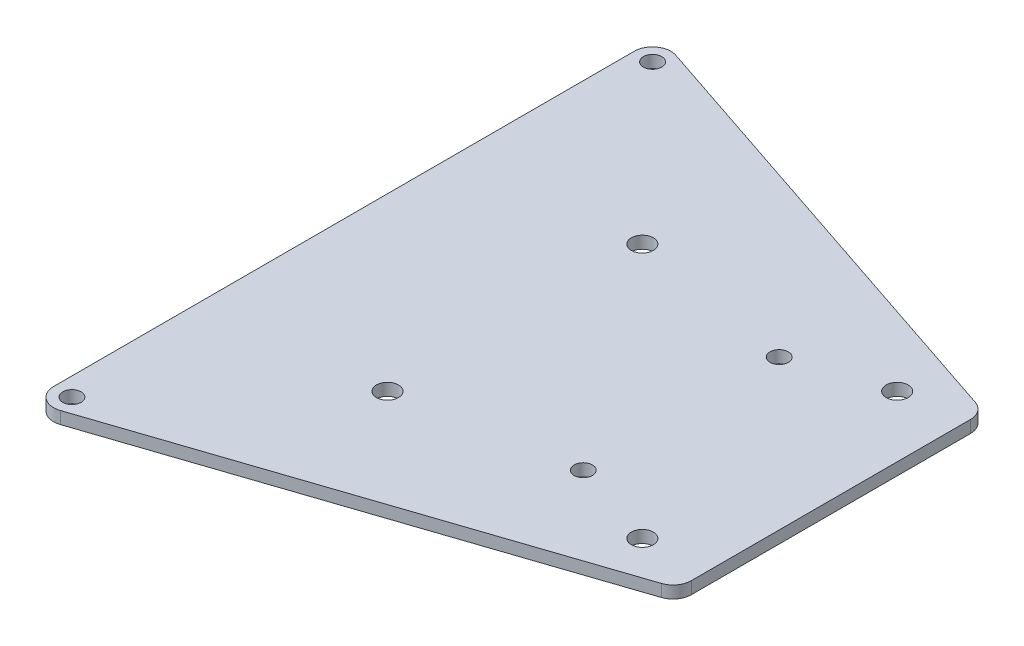
ISO-10303-21;
HEADER;
FILE_DESCRIPTION(('STEP AP214'),'2;1');
FILE_NAME('part.step','',(''),(''),'','','');
FILE_SCHEMA(('AUTOMOTIVE_DESIGN { 1 0 10303 214 1 1 1 1 }'));
ENDSEC;
DATA;
#1=APPLICATION_CONTEXT('core data for automotive mechanical design processes');
#2=APPLICATION_PROTOCOL_DEFINITION('international standard','automotive_design',2000,#1);
#3=PRODUCT_CONTEXT('',#1,'mechanical');
#4=PRODUCT('Part','Part','',(#3));
#5=PRODUCT_RELATED_PRODUCT_CATEGORY('part','',(#4));
#6=PRODUCT_DEFINITION_FORMATION('','',#4);
#7=PRODUCT_DEFINITION_CONTEXT('part definition',#1,'design');
#8=PRODUCT_DEFINITION('design','',#6,#7);
#9=PRODUCT_DEFINITION_SHAPE('','',#8);
#10=(LENGTH_UNIT() NAMED_UNIT(*) SI_UNIT(.MILLI.,.METRE.));
#11=(NAMED_UNIT(*) PLANE_ANGLE_UNIT() SI_UNIT($,.RADIAN.));
#12=(NAMED_UNIT(*) SI_UNIT($,.STERADIAN.) SOLID_ANGLE_UNIT());
#13=UNCERTAINTY_MEASURE_WITH_UNIT(LENGTH_MEASURE(1.E-05),#10,'distance_accuracy_value','');
#14=(GEOMETRIC_REPRESENTATION_CONTEXT(3) GLOBAL_UNCERTAINTY_ASSIGNED_CONTEXT((#13)) GLOBAL_UNIT_ASSIGNED_CONTEXT((#10,
#11,#12)) REPRESENTATION_CONTEXT('',''));
#15=CARTESIAN_POINT('',(0.,0.,0.));
#16=DIRECTION('',(0.,0.,1.));
#17=DIRECTION('',(1.,0.,0.));
#18=AXIS2_PLACEMENT_3D('',#15,#16,#17);
#19=CARTESIAN_POINT('',(73.72,2.,24.6841957224712));
#20=DIRECTION('',(0.,-1.,0.));
#21=DIRECTION('',(0.,0.,-1.));
#22=AXIS2_PLACEMENT_3D('',#19,#20,#21);
#23=CYLINDRICAL_SURFACE('',#22,3.00000000000001);
#24=CARTESIAN_POINT('',(73.72,0.,24.6841957224712));
#25=DIRECTION('',(0.,1.,0.));
#26=DIRECTION('',(0.,0.,1.));
#27=AXIS2_PLACEMENT_3D('',#24,#25,#26);
#28=CIRCLE('',#27,3.00000000000001);
#29=CARTESIAN_POINT('',(74.6725326685041,0.,21.8394318455506));
#30=VERTEX_POINT('',#29);
#31=CARTESIAN_POINT('',(76.72,0.,24.6841957224712));
#32=VERTEX_POINT('',#31);
#33=EDGE_CURVE('E159',#30,#32,#28,.F.);
#34=ORIENTED_EDGE('',*,*,#33,.F.);
#35=DIRECTION('',(0.,-1.,0.));
#36=VECTOR('',#35,1.);
#37=CARTESIAN_POINT('',(74.6725326685041,2.,21.8394318455506));
#38=LINE('',#37,#36);
#39=CARTESIAN_POINT('',(74.6725326685041,2.,21.8394318455506));
#40=VERTEX_POINT('',#39);
#41=EDGE_CURVE('E11',#40,#30,#38,.T.);
#42=ORIENTED_EDGE('',*,*,#41,.F.);
#43=CARTESIAN_POINT('',(73.72,2.,24.6841957224712));
#44=DIRECTION('',(0.,1.,0.));
#45=DIRECTION('',(0.,0.,1.));
#46=AXIS2_PLACEMENT_3D('',#43,#44,#45);
#47=CIRCLE('',#46,3.00000000000001);
#48=CARTESIAN_POINT('',(76.72,2.,24.6841957224712));
#49=VERTEX_POINT('',#48);
#50=EDGE_CURVE('E231',#40,#49,#47,.F.);
#51=ORIENTED_EDGE('',*,*,#50,.T.);
#52=DIRECTION('',(0.,-1.,0.));
#53=VECTOR('',#52,1.);
#54=CARTESIAN_POINT('',(76.72,2.,24.6841957224712));
#55=LINE('',#54,#53);
#56=EDGE_CURVE('E59',#49,#32,#55,.T.);
#57=ORIENTED_EDGE('',*,*,#56,.T.);
#58=EDGE_LOOP('',(#34,#42,#51,#57));
#59=FACE_BOUND('',#58,.T.);
#60=ADVANCED_FACE('F41',(#59),#23,.T.);
#61=CARTESIAN_POINT('',(0.952532668504129,2.,-2.84476387692061));
#62=DIRECTION('',(0.317510889501376,0.,-0.948254625640205));
#63=DIRECTION('',(-0.948254625640205,0.,-0.317510889501377));
#64=AXIS2_PLACEMENT_3D('',#61,#62,#63);
#65=PLANE('',#64);
#66=DIRECTION('',(0.948254625640205,0.,0.317510889501377));
#67=VECTOR('',#66,1.);
#68=CARTESIAN_POINT('',(0.952532668504129,0.,-2.84476387692061));
#69=LINE('',#68,#67);
#70=CARTESIAN_POINT('',(0.952532668504129,0.,-2.84476387692061));
#71=VERTEX_POINT('',#70);
#72=EDGE_CURVE('E165',#71,#30,#69,.T.);
#73=ORIENTED_EDGE('',*,*,#72,.F.);
#74=DIRECTION('',(0.,-1.,0.));
#75=VECTOR('',#74,1.);
#76=CARTESIAN_POINT('',(0.952532668504129,2.,-2.84476387692061));
#77=LINE('',#76,#75);
#78=CARTESIAN_POINT('',(0.952532668504129,2.,-2.84476387692061));
#79=VERTEX_POINT('',#78);
#80=EDGE_CURVE('E49',#79,#71,#77,.T.);
#81=ORIENTED_EDGE('',*,*,#80,.F.);
#82=DIRECTION('',(0.948254625640205,0.,0.317510889501377));
#83=VECTOR('',#82,1.);
#84=CARTESIAN_POINT('',(0.952532668504129,2.,-2.84476387692061));
#85=LINE('',#84,#83);
#86=EDGE_CURVE('E227',#79,#40,#85,.T.);
#87=ORIENTED_EDGE('',*,*,#86,.T.);
#88=ORIENTED_EDGE('',*,*,#41,.T.);
#89=EDGE_LOOP('',(#73,#81,#87,#88));
#90=FACE_BOUND('',#89,.T.);
#91=ADVANCED_FACE('F217',(#90),#65,.T.);
#92=CARTESIAN_POINT('',(0.,2.,0.));
#93=DIRECTION('',(0.,-1.,0.));
#94=DIRECTION('',(0.,0.,-1.));
#95=AXIS2_PLACEMENT_3D('',#92,#93,#94);
#96=CYLINDRICAL_SURFACE('',#95,3.);
#97=CARTESIAN_POINT('',(0.,0.,0.));
#98=DIRECTION('',(0.,1.,0.));
#99=DIRECTION('',(0.,0.,1.));
#100=AXIS2_PLACEMENT_3D('',#97,#98,#99);
#101=CIRCLE('',#100,3.);
#102=CARTESIAN_POINT('',(-3.,0.,0.));
#103=VERTEX_POINT('',#102);
#104=EDGE_CURVE('E164',#103,#71,#101,.F.);
#105=ORIENTED_EDGE('',*,*,#104,.F.);
#106=DIRECTION('',(0.,-1.,0.));
#107=VECTOR('',#106,1.);
#108=CARTESIAN_POINT('',(-3.,2.,0.));
#109=LINE('',#108,#107);
#110=CARTESIAN_POINT('',(-3.,2.,0.));
#111=VERTEX_POINT('',#110);
#112=EDGE_CURVE('E210',#111,#103,#109,.T.);
#113=ORIENTED_EDGE('',*,*,#112,.F.);
#114=CARTESIAN_POINT('',(0.,2.,0.));
#115=DIRECTION('',(0.,1.,0.));
#116=DIRECTION('',(0.,0.,1.));
#117=AXIS2_PLACEMENT_3D('',#114,#115,#116);
#118=CIRCLE('',#117,3.);
#119=EDGE_CURVE('E212',#111,#79,#118,.F.);
#120=ORIENTED_EDGE('',*,*,#119,.T.);
#121=ORIENTED_EDGE('',*,*,#80,.T.);
#122=EDGE_LOOP('',(#105,#113,#120,#121));
#123=FACE_BOUND('',#122,.T.);
#124=ADVANCED_FACE('F215',(#123),#96,.T.);
#125=CARTESIAN_POINT('',(-3.,2.,0.));
#126=DIRECTION('',(-1.,0.,0.));
#127=DIRECTION('',(0.,0.,1.));
#128=AXIS2_PLACEMENT_3D('',#125,#126,#127);
#129=PLANE('',#128);
#130=DIRECTION('',(0.,0.,-1.));
#131=VECTOR('',#130,1.);
#132=CARTESIAN_POINT('',(-3.,0.,0.));
#133=LINE('',#132,#131);
#134=CARTESIAN_POINT('',(-3.,0.,95.05));
#135=VERTEX_POINT('',#134);
#136=EDGE_CURVE('E169',#135,#103,#133,.T.);
#137=ORIENTED_EDGE('',*,*,#136,.F.);
#138=DIRECTION('',(0.,-1.,0.));
#139=VECTOR('',#138,1.);
#140=CARTESIAN_POINT('',(-3.,2.,95.05));
#141=LINE('',#140,#139);
#142=CARTESIAN_POINT('',(-3.,2.,95.05));
#143=VERTEX_POINT('',#142);
#144=EDGE_CURVE('E202',#143,#135,#141,.T.);
#145=ORIENTED_EDGE('',*,*,#144,.F.);
#146=DIRECTION('',(0.,0.,-1.));
#147=VECTOR('',#146,1.);
#148=CARTESIAN_POINT('',(-3.,2.,0.));
#149=LINE('',#148,#147);
#150=EDGE_CURVE('E230',#143,#111,#149,.T.);
#151=ORIENTED_EDGE('',*,*,#150,.T.);
#152=ORIENTED_EDGE('',*,*,#112,.T.);
#153=EDGE_LOOP('',(#137,#145,#151,#152));
#154=FACE_BOUND('',#153,.T.);
#155=ADVANCED_FACE('F223',(#154),#129,.T.);
#156=CARTESIAN_POINT('',(0.,2.,95.05));
#157=DIRECTION('',(0.,-1.,0.));
#158=DIRECTION('',(0.,0.,-1.));
#159=AXIS2_PLACEMENT_3D('',#156,#157,#158);
#160=CYLINDRICAL_SURFACE('',#159,3.);
#161=CARTESIAN_POINT('',(0.,0.,95.05));
#162=DIRECTION('',(0.,1.,0.));
#163=DIRECTION('',(0.,0.,1.));
#164=AXIS2_PLACEMENT_3D('',#161,#162,#163);
#165=CIRCLE('',#164,3.);
#166=CARTESIAN_POINT('',(0.952532668504126,0.,97.8947638769206));
#167=VERTEX_POINT('',#166);
#168=EDGE_CURVE('E171',#167,#135,#165,.F.);
#169=ORIENTED_EDGE('',*,*,#168,.F.);
#170=DIRECTION('',(0.,-1.,0.));
#171=VECTOR('',#170,1.);
#172=CARTESIAN_POINT('',(0.952532668504126,2.,97.8947638769206));
#173=LINE('',#172,#171);
#174=CARTESIAN_POINT('',(0.952532668504126,2.,97.8947638769206));
#175=VERTEX_POINT('',#174);
#176=EDGE_CURVE('E120',#175,#167,#173,.T.);
#177=ORIENTED_EDGE('',*,*,#176,.F.);
#178=CARTESIAN_POINT('',(0.,2.,95.05));
#179=DIRECTION('',(0.,1.,0.));
#180=DIRECTION('',(0.,0.,1.));
#181=AXIS2_PLACEMENT_3D('',#178,#179,#180);
#182=CIRCLE('',#181,3.);
#183=EDGE_CURVE('E126',#175,#143,#182,.F.);
#184=ORIENTED_EDGE('',*,*,#183,.T.);
#185=ORIENTED_EDGE('',*,*,#144,.T.);
#186=EDGE_LOOP('',(#169,#177,#184,#185));
#187=FACE_BOUND('',#186,.T.);
#188=ADVANCED_FACE('F234',(#187),#160,.T.);
#189=CARTESIAN_POINT('',(29.5702978447647,2.,88.3124725482373));
#190=DIRECTION('',(0.317510889501376,0.,0.948254625640205));
#191=DIRECTION('',(0.948254625640205,0.,-0.317510889501377));
#192=AXIS2_PLACEMENT_3D('',#189,#190,#191);
#193=PLANE('',#192);
#194=DIRECTION('',(-0.948254625640205,0.,0.317510889501377));
#195=VECTOR('',#194,1.);
#196=CARTESIAN_POINT('',(29.5702978447647,0.,88.3124725482373));
#197=LINE('',#196,#195);
#198=CARTESIAN_POINT('',(74.6725326685041,0.,73.2105681544494));
#199=VERTEX_POINT('',#198);
#200=EDGE_CURVE('E114',#199,#167,#197,.T.);
#201=ORIENTED_EDGE('',*,*,#200,.F.);
#202=DIRECTION('',(0.,-1.,0.));
#203=VECTOR('',#202,1.);
#204=CARTESIAN_POINT('',(74.6725326685041,2.,73.2105681544494));
#205=LINE('',#204,#203);
#206=CARTESIAN_POINT('',(74.6725326685041,2.,73.2105681544494));
#207=VERTEX_POINT('',#206);
#208=EDGE_CURVE('E107',#207,#199,#205,.T.);
#209=ORIENTED_EDGE('',*,*,#208,.F.);
#210=DIRECTION('',(-0.948254625640205,0.,0.317510889501377));
#211=VECTOR('',#210,1.);
#212=CARTESIAN_POINT('',(29.5702978447647,2.,88.3124725482373));
#213=LINE('',#212,#211);
#214=EDGE_CURVE('E112',#207,#175,#213,.T.);
#215=ORIENTED_EDGE('',*,*,#214,.T.);
#216=ORIENTED_EDGE('',*,*,#176,.T.);
#217=EDGE_LOOP('',(#201,#209,#215,#216));
#218=FACE_BOUND('',#217,.T.);
#219=ADVANCED_FACE('F109',(#218),#193,.T.);
#220=CARTESIAN_POINT('',(73.72,2.,70.3658042775288));
#221=DIRECTION('',(0.,-1.,0.));
#222=DIRECTION('',(0.,0.,-1.));
#223=AXIS2_PLACEMENT_3D('',#220,#221,#222);
#224=CYLINDRICAL_SURFACE('',#223,3.);
#225=CARTESIAN_POINT('',(73.72,0.,70.3658042775288));
#226=DIRECTION('',(0.,1.,0.));
#227=DIRECTION('',(0.,0.,1.));
#228=AXIS2_PLACEMENT_3D('',#225,#226,#227);
#229=CIRCLE('',#228,3.);
#230=CARTESIAN_POINT('',(76.72,0.,70.3658042775288));
#231=VERTEX_POINT('',#230);
#232=EDGE_CURVE('E174',#231,#199,#229,.F.);
#233=ORIENTED_EDGE('',*,*,#232,.F.);
#234=DIRECTION('',(0.,-1.,0.));
#235=VECTOR('',#234,1.);
#236=CARTESIAN_POINT('',(76.72,2.,70.3658042775288));
#237=LINE('',#236,#235);
#238=CARTESIAN_POINT('',(76.72,2.,70.3658042775288));
#239=VERTEX_POINT('',#238);
#240=EDGE_CURVE('E83',#239,#231,#237,.T.);
#241=ORIENTED_EDGE('',*,*,#240,.F.);
#242=CARTESIAN_POINT('',(73.72,2.,70.3658042775288));
#243=DIRECTION('',(0.,1.,0.));
#244=DIRECTION('',(0.,0.,1.));
#245=AXIS2_PLACEMENT_3D('',#242,#243,#244);
#246=CIRCLE('',#245,3.);
#247=EDGE_CURVE('E124',#239,#207,#246,.F.);
#248=ORIENTED_EDGE('',*,*,#247,.T.);
#249=ORIENTED_EDGE('',*,*,#208,.T.);
#250=EDGE_LOOP('',(#233,#241,#248,#249));
#251=FACE_BOUND('',#250,.T.);
#252=ADVANCED_FACE('F128',(#251),#224,.T.);
#253=CARTESIAN_POINT('',(25.,2.,68.395));
#254=DIRECTION('',(0.,-1.,0.));
#255=DIRECTION('',(0.,0.,-1.));
#256=AXIS2_PLACEMENT_3D('',#253,#254,#255);
#257=CYLINDRICAL_SURFACE('',#256,1.8);
#258=CARTESIAN_POINT('',(25.,2.,68.395));
#259=DIRECTION('',(0.,1.,0.));
#260=DIRECTION('',(0.,0.,1.));
#261=AXIS2_PLACEMENT_3D('',#258,#259,#260);
#262=CIRCLE('',#261,1.8);
#263=CARTESIAN_POINT('',(25.,2.,70.195));
#264=VERTEX_POINT('',#263);
#265=EDGE_CURVE('E151',#264,#264,#262,.T.);
#266=ORIENTED_EDGE('',*,*,#265,.T.);
#267=EDGE_LOOP('',(#266));
#268=FACE_BOUND('',#267,.T.);
#269=CARTESIAN_POINT('',(25.,0.,68.395));
#270=DIRECTION('',(0.,1.,0.));
#271=DIRECTION('',(0.,0.,1.));
#272=AXIS2_PLACEMENT_3D('',#269,#270,#271);
#273=CIRCLE('',#272,1.8);
#274=CARTESIAN_POINT('',(25.,0.,70.195));
#275=VERTEX_POINT('',#274);
#276=EDGE_CURVE('E194',#275,#275,#273,.T.);
#277=ORIENTED_EDGE('',*,*,#276,.F.);
#278=EDGE_LOOP('',(#277));
#279=FACE_BOUND('',#278,.T.);
#280=ADVANCED_FACE('F262',(#268,#279),#257,.F.);
#281=CARTESIAN_POINT('',(66.72,2.,26.675));
#282=DIRECTION('',(0.,-1.,0.));
#283=DIRECTION('',(0.,0.,-1.));
#284=AXIS2_PLACEMENT_3D('',#281,#282,#283);
#285=CYLINDRICAL_SURFACE('',#284,1.79999999999999);
#286=CARTESIAN_POINT('',(66.72,2.,26.675));
#287=DIRECTION('',(0.,1.,0.));
#288=DIRECTION('',(0.,0.,1.));
#289=AXIS2_PLACEMENT_3D('',#286,#287,#288);
#290=CIRCLE('',#289,1.79999999999999);
#291=CARTESIAN_POINT('',(66.72,2.,28.475));
#292=VERTEX_POINT('',#291);
#293=EDGE_CURVE('E146',#292,#292,#290,.T.);
#294=ORIENTED_EDGE('',*,*,#293,.T.);
#295=EDGE_LOOP('',(#294));
#296=FACE_BOUND('',#295,.T.);
#297=CARTESIAN_POINT('',(66.72,0.,26.675));
#298=DIRECTION('',(0.,1.,0.));
#299=DIRECTION('',(0.,0.,1.));
#300=AXIS2_PLACEMENT_3D('',#297,#298,#299);
#301=CIRCLE('',#300,1.79999999999999);
#302=CARTESIAN_POINT('',(66.72,0.,28.475));
#303=VERTEX_POINT('',#302);
#304=EDGE_CURVE('E195',#303,#303,#301,.T.);
#305=ORIENTED_EDGE('',*,*,#304,.F.);
#306=EDGE_LOOP('',(#305));
#307=FACE_BOUND('',#306,.T.);
#308=ADVANCED_FACE('F268',(#296,#307),#285,.F.);
#309=CARTESIAN_POINT('',(66.72,2.,68.395));
#310=DIRECTION('',(0.,-1.,0.));
#311=DIRECTION('',(0.,0.,-1.));
#312=AXIS2_PLACEMENT_3D('',#309,#310,#311);
#313=CYLINDRICAL_SURFACE('',#312,1.79999999999998);
#314=CARTESIAN_POINT('',(66.72,2.,68.395));
#315=DIRECTION('',(0.,1.,0.));
#316=DIRECTION('',(0.,0.,1.));
#317=AXIS2_PLACEMENT_3D('',#314,#315,#316);
#318=CIRCLE('',#317,1.79999999999998);
#319=CARTESIAN_POINT('',(66.72,2.,70.195));
#320=VERTEX_POINT('',#319);
#321=EDGE_CURVE('E144',#320,#320,#318,.T.);
#322=ORIENTED_EDGE('',*,*,#321,.T.);
#323=EDGE_LOOP('',(#322));
#324=FACE_BOUND('',#323,.T.);
#325=CARTESIAN_POINT('',(66.72,0.,68.395));
#326=DIRECTION('',(0.,1.,0.));
#327=DIRECTION('',(0.,0.,1.));
#328=AXIS2_PLACEMENT_3D('',#325,#326,#327);
#329=CIRCLE('',#328,1.79999999999998);
#330=CARTESIAN_POINT('',(66.72,0.,70.195));
#331=VERTEX_POINT('',#330);
#332=EDGE_CURVE('E188',#331,#331,#329,.T.);
#333=ORIENTED_EDGE('',*,*,#332,.F.);
#334=EDGE_LOOP('',(#333));
#335=FACE_BOUND('',#334,.T.);
#336=ADVANCED_FACE('F273',(#324,#335),#313,.F.);
#337=CARTESIAN_POINT('',(0.,2.,0.));
#338=DIRECTION('',(0.,-1.,0.));
#339=DIRECTION('',(0.,0.,-1.));
#340=AXIS2_PLACEMENT_3D('',#337,#338,#339);
#341=CYLINDRICAL_SURFACE('',#340,1.5);
#342=CARTESIAN_POINT('',(0.,2.,0.));
#343=DIRECTION('',(0.,1.,0.));
#344=DIRECTION('',(0.,0.,1.));
#345=AXIS2_PLACEMENT_3D('',#342,#343,#344);
#346=CIRCLE('',#345,1.5);
#347=CARTESIAN_POINT('',(0.,2.,1.5));
#348=VERTEX_POINT('',#347);
#349=EDGE_CURVE('E142',#348,#348,#346,.T.);
#350=ORIENTED_EDGE('',*,*,#349,.T.);
#351=EDGE_LOOP('',(#350));
#352=FACE_BOUND('',#351,.T.);
#353=CARTESIAN_POINT('',(0.,0.,0.));
#354=DIRECTION('',(0.,1.,0.));
#355=DIRECTION('',(0.,0.,1.));
#356=AXIS2_PLACEMENT_3D('',#353,#354,#355);
#357=CIRCLE('',#356,1.5);
#358=CARTESIAN_POINT('',(0.,0.,1.5));
#359=VERTEX_POINT('',#358);
#360=EDGE_CURVE('E186',#359,#359,#357,.T.);
#361=ORIENTED_EDGE('',*,*,#360,.F.);
#362=EDGE_LOOP('',(#361));
#363=FACE_BOUND('',#362,.T.);
#364=ADVANCED_FACE('F282',(#352,#363),#341,.F.);
#365=CARTESIAN_POINT('',(52.22,2.,31.49));
#366=DIRECTION('',(0.,-1.,0.));
#367=DIRECTION('',(0.,0.,-1.));
#368=AXIS2_PLACEMENT_3D('',#365,#366,#367);
#369=CYLINDRICAL_SURFACE('',#368,1.5);
#370=CARTESIAN_POINT('',(52.22,2.,31.49));
#371=DIRECTION('',(0.,1.,0.));
#372=DIRECTION('',(0.,0.,1.));
#373=AXIS2_PLACEMENT_3D('',#370,#371,#372);
#374=CIRCLE('',#373,1.5);
#375=CARTESIAN_POINT('',(52.22,2.,32.99));
#376=VERTEX_POINT('',#375);
#377=EDGE_CURVE('E137',#376,#376,#374,.T.);
#378=ORIENTED_EDGE('',*,*,#377,.T.);
#379=EDGE_LOOP('',(#378));
#380=FACE_BOUND('',#379,.T.);
#381=CARTESIAN_POINT('',(52.22,0.,31.49));
#382=DIRECTION('',(0.,1.,0.));
#383=DIRECTION('',(0.,0.,1.));
#384=AXIS2_PLACEMENT_3D('',#381,#382,#383);
#385=CIRCLE('',#384,1.5);
#386=CARTESIAN_POINT('',(52.22,0.,32.99));
#387=VERTEX_POINT('',#386);
#388=EDGE_CURVE('E181',#387,#387,#385,.T.);
#389=ORIENTED_EDGE('',*,*,#388,.F.);
#390=EDGE_LOOP('',(#389));
#391=FACE_BOUND('',#390,.T.);
#392=ADVANCED_FACE('F246',(#380,#391),#369,.F.);
#393=CARTESIAN_POINT('',(52.22,2.,63.56));
#394=DIRECTION('',(0.,-1.,0.));
#395=DIRECTION('',(0.,0.,-1.));
#396=AXIS2_PLACEMENT_3D('',#393,#394,#395);
#397=CYLINDRICAL_SURFACE('',#396,1.5);
#398=CARTESIAN_POINT('',(52.22,2.,63.56));
#399=DIRECTION('',(0.,1.,0.));
#400=DIRECTION('',(0.,0.,1.));
#401=AXIS2_PLACEMENT_3D('',#398,#399,#400);
#402=CIRCLE('',#401,1.5);
#403=CARTESIAN_POINT('',(52.22,2.,65.06));
#404=VERTEX_POINT('',#403);
#405=EDGE_CURVE('E132',#404,#404,#402,.T.);
#406=ORIENTED_EDGE('',*,*,#405,.T.);
#407=EDGE_LOOP('',(#406));
#408=FACE_BOUND('',#407,.T.);
#409=CARTESIAN_POINT('',(52.22,0.,63.56));
#410=DIRECTION('',(0.,1.,0.));
#411=DIRECTION('',(0.,0.,1.));
#412=AXIS2_PLACEMENT_3D('',#409,#410,#411);
#413=CIRCLE('',#412,1.5);
#414=CARTESIAN_POINT('',(52.22,0.,65.06));
#415=VERTEX_POINT('',#414);
#416=EDGE_CURVE('E179',#415,#415,#413,.T.);
#417=ORIENTED_EDGE('',*,*,#416,.F.);
#418=EDGE_LOOP('',(#417));
#419=FACE_BOUND('',#418,.T.);
#420=ADVANCED_FACE('F236',(#408,#419),#397,.F.);
#421=CARTESIAN_POINT('',(76.72,2.,0.));
#422=DIRECTION('',(1.,0.,0.));
#423=DIRECTION('',(0.,0.,-1.));
#424=AXIS2_PLACEMENT_3D('',#421,#422,#423);
#425=PLANE('',#424);
#426=DIRECTION('',(0.,0.,1.));
#427=VECTOR('',#426,1.);
#428=CARTESIAN_POINT('',(76.72,0.,0.));
#429=LINE('',#428,#427);
#430=EDGE_CURVE('E180',#32,#231,#429,.T.);
#431=ORIENTED_EDGE('',*,*,#430,.F.);
#432=ORIENTED_EDGE('',*,*,#56,.F.);
#433=DIRECTION('',(0.,0.,1.));
#434=VECTOR('',#433,1.);
#435=CARTESIAN_POINT('',(76.72,2.,0.));
#436=LINE('',#435,#434);
#437=EDGE_CURVE('E131',#49,#239,#436,.T.);
#438=ORIENTED_EDGE('',*,*,#437,.T.);
#439=ORIENTED_EDGE('',*,*,#240,.T.);
#440=EDGE_LOOP('',(#431,#432,#438,#439));
#441=FACE_BOUND('',#440,.T.);
#442=ADVANCED_FACE('F237',(#441),#425,.T.);
#443=CARTESIAN_POINT('',(0.,2.,95.05));
#444=DIRECTION('',(0.,-1.,0.));
#445=DIRECTION('',(0.,0.,-1.));
#446=AXIS2_PLACEMENT_3D('',#443,#444,#445);
#447=CYLINDRICAL_SURFACE('',#446,1.5);
#448=CARTESIAN_POINT('',(0.,2.,95.05));
#449=DIRECTION('',(0.,1.,0.));
#450=DIRECTION('',(0.,0.,1.));
#451=AXIS2_PLACEMENT_3D('',#448,#449,#450);
#452=CIRCLE('',#451,1.5);
#453=CARTESIAN_POINT('',(0.,2.,96.55));
#454=VERTEX_POINT('',#453);
#455=EDGE_CURVE('E203',#454,#454,#452,.T.);
#456=ORIENTED_EDGE('',*,*,#455,.T.);
#457=EDGE_LOOP('',(#456));
#458=FACE_BOUND('',#457,.T.);
#459=CARTESIAN_POINT('',(0.,0.,95.05));
#460=DIRECTION('',(0.,1.,0.));
#461=DIRECTION('',(0.,0.,1.));
#462=AXIS2_PLACEMENT_3D('',#459,#460,#461);
#463=CIRCLE('',#462,1.5);
#464=CARTESIAN_POINT('',(0.,0.,96.55));
#465=VERTEX_POINT('',#464);
#466=EDGE_CURVE('E160',#465,#465,#463,.T.);
#467=ORIENTED_EDGE('',*,*,#466,.F.);
#468=EDGE_LOOP('',(#467));
#469=FACE_BOUND('',#468,.T.);
#470=ADVANCED_FACE('F43',(#458,#469),#447,.F.);
#471=CARTESIAN_POINT('',(25.,2.,26.675));
#472=DIRECTION('',(0.,-1.,0.));
#473=DIRECTION('',(0.,0.,-1.));
#474=AXIS2_PLACEMENT_3D('',#471,#472,#473);
#475=CYLINDRICAL_SURFACE('',#474,1.8);
#476=CARTESIAN_POINT('',(25.,2.,26.675));
#477=DIRECTION('',(0.,1.,0.));
#478=DIRECTION('',(0.,0.,1.));
#479=AXIS2_PLACEMENT_3D('',#476,#477,#478);
#480=CIRCLE('',#479,1.8);
#481=CARTESIAN_POINT('',(25.,2.,28.475));
#482=VERTEX_POINT('',#481);
#483=EDGE_CURVE('E152',#482,#482,#480,.T.);
#484=ORIENTED_EDGE('',*,*,#483,.T.);
#485=EDGE_LOOP('',(#484));
#486=FACE_BOUND('',#485,.T.);
#487=CARTESIAN_POINT('',(25.,0.,26.675));
#488=DIRECTION('',(0.,1.,0.));
#489=DIRECTION('',(0.,0.,1.));
#490=AXIS2_PLACEMENT_3D('',#487,#488,#489);
#491=CIRCLE('',#490,1.8);
#492=CARTESIAN_POINT('',(25.,0.,28.475));
#493=VERTEX_POINT('',#492);
#494=EDGE_CURVE('E196',#493,#493,#491,.T.);
#495=ORIENTED_EDGE('',*,*,#494,.F.);
#496=EDGE_LOOP('',(#495));
#497=FACE_BOUND('',#496,.T.);
#498=ADVANCED_FACE('F243',(#486,#497),#475,.F.);
#499=CARTESIAN_POINT('',(0.,2.,0.));
#500=DIRECTION('',(0.,1.,0.));
#501=DIRECTION('',(0.,0.,1.));
#502=AXIS2_PLACEMENT_3D('',#499,#500,#501);
#503=PLANE('',#502);
#504=ORIENTED_EDGE('',*,*,#455,.F.);
#505=EDGE_LOOP('',(#504));
#506=FACE_BOUND('',#505,.T.);
#507=ORIENTED_EDGE('',*,*,#50,.F.);
#508=ORIENTED_EDGE('',*,*,#86,.F.);
#509=ORIENTED_EDGE('',*,*,#119,.F.);
#510=ORIENTED_EDGE('',*,*,#150,.F.);
#511=ORIENTED_EDGE('',*,*,#183,.F.);
#512=ORIENTED_EDGE('',*,*,#214,.F.);
#513=ORIENTED_EDGE('',*,*,#247,.F.);
#514=ORIENTED_EDGE('',*,*,#437,.F.);
#515=EDGE_LOOP('',(#507,#508,#509,#510,#511,#512,#513,#514));
#516=FACE_BOUND('',#515,.T.);
#517=ORIENTED_EDGE('',*,*,#405,.F.);
#518=EDGE_LOOP('',(#517));
#519=FACE_BOUND('',#518,.T.);
#520=ORIENTED_EDGE('',*,*,#377,.F.);
#521=EDGE_LOOP('',(#520));
#522=FACE_BOUND('',#521,.T.);
#523=ORIENTED_EDGE('',*,*,#349,.F.);
#524=EDGE_LOOP('',(#523));
#525=FACE_BOUND('',#524,.T.);
#526=ORIENTED_EDGE('',*,*,#321,.F.);
#527=EDGE_LOOP('',(#526));
#528=FACE_BOUND('',#527,.T.);
#529=ORIENTED_EDGE('',*,*,#293,.F.);
#530=EDGE_LOOP('',(#529));
#531=FACE_BOUND('',#530,.T.);
#532=ORIENTED_EDGE('',*,*,#265,.F.);
#533=EDGE_LOOP('',(#532));
#534=FACE_BOUND('',#533,.T.);
#535=ORIENTED_EDGE('',*,*,#483,.F.);
#536=EDGE_LOOP('',(#535));
#537=FACE_BOUND('',#536,.T.);
#538=ADVANCED_FACE('F125',(#506,#516,#519,#522,#525,#528,#531,#534,#537),#503,.T.);
#539=CARTESIAN_POINT('',(0.,0.,0.));
#540=DIRECTION('',(0.,1.,0.));
#541=DIRECTION('',(0.,0.,1.));
#542=AXIS2_PLACEMENT_3D('',#539,#540,#541);
#543=PLANE('',#542);
#544=ORIENTED_EDGE('',*,*,#466,.T.);
#545=EDGE_LOOP('',(#544));
#546=FACE_BOUND('',#545,.T.);
#547=ORIENTED_EDGE('',*,*,#33,.T.);
#548=ORIENTED_EDGE('',*,*,#430,.T.);
#549=ORIENTED_EDGE('',*,*,#232,.T.);
#550=ORIENTED_EDGE('',*,*,#200,.T.);
#551=ORIENTED_EDGE('',*,*,#168,.T.);
#552=ORIENTED_EDGE('',*,*,#136,.T.);
#553=ORIENTED_EDGE('',*,*,#104,.T.);
#554=ORIENTED_EDGE('',*,*,#72,.T.);
#555=EDGE_LOOP('',(#547,#548,#549,#550,#551,#552,#553,#554));
#556=FACE_BOUND('',#555,.T.);
#557=ORIENTED_EDGE('',*,*,#416,.T.);
#558=EDGE_LOOP('',(#557));
#559=FACE_BOUND('',#558,.T.);
#560=ORIENTED_EDGE('',*,*,#388,.T.);
#561=EDGE_LOOP('',(#560));
#562=FACE_BOUND('',#561,.T.);
#563=ORIENTED_EDGE('',*,*,#360,.T.);
#564=EDGE_LOOP('',(#563));
#565=FACE_BOUND('',#564,.T.);
#566=ORIENTED_EDGE('',*,*,#332,.T.);
#567=EDGE_LOOP('',(#566));
#568=FACE_BOUND('',#567,.T.);
#569=ORIENTED_EDGE('',*,*,#304,.T.);
#570=EDGE_LOOP('',(#569));
#571=FACE_BOUND('',#570,.T.);
#572=ORIENTED_EDGE('',*,*,#276,.T.);
#573=EDGE_LOOP('',(#572));
#574=FACE_BOUND('',#573,.T.);
#575=ORIENTED_EDGE('',*,*,#494,.T.);
#576=EDGE_LOOP('',(#575));
#577=FACE_BOUND('',#576,.T.);
#578=ADVANCED_FACE('F219',(#546,#556,#559,#562,#565,#568,#571,#574,#577),#543,.F.);
#579=CLOSED_SHELL('',(#60,#91,#124,#155,#188,#219,#252,#280,#308,#336,#364,#392,#420,#442,#470,
#498,#538,#578));
#580=MANIFOLD_SOLID_BREP('B2',#579);
#581=ADVANCED_BREP_SHAPE_REPRESENTATION('',(#18,#580),#14);
#582=SHAPE_DEFINITION_REPRESENTATION(#9,#581);
ENDSEC;
END-ISO-10303-21;
